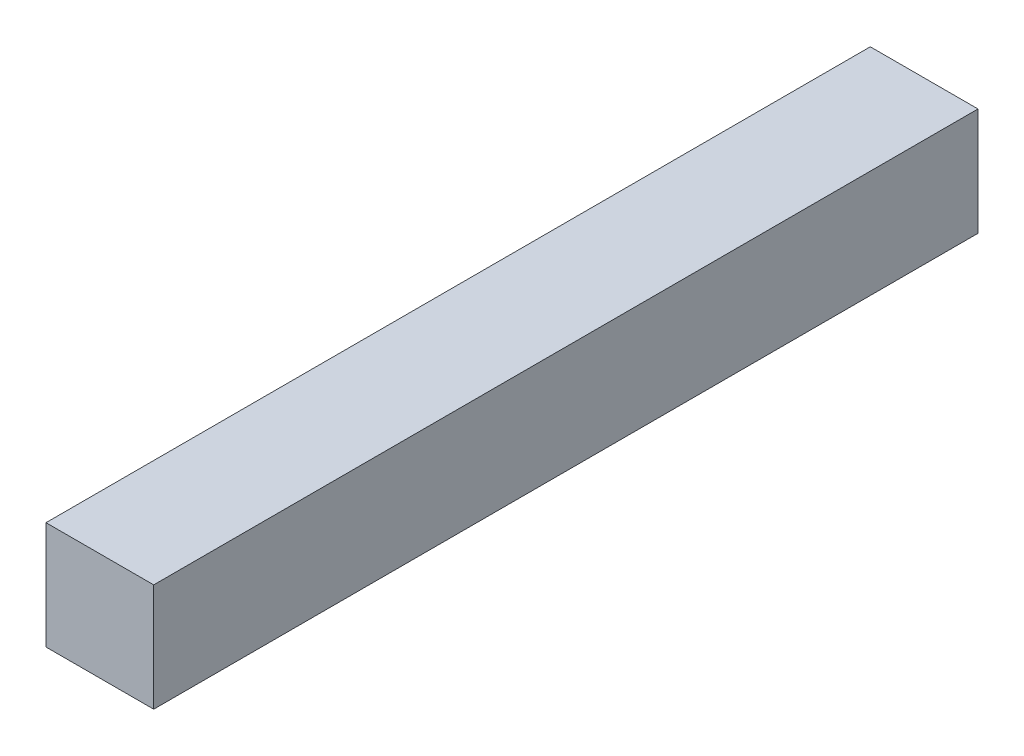
ISO-10303-21;
HEADER;
FILE_DESCRIPTION(('STEP AP214'),'2;1');
FILE_NAME('part.step','',(''),(''),'','','');
FILE_SCHEMA(('AUTOMOTIVE_DESIGN { 1 0 10303 214 1 1 1 1 }'));
ENDSEC;
DATA;
#1=APPLICATION_CONTEXT('core data for automotive mechanical design processes');
#2=APPLICATION_PROTOCOL_DEFINITION('international standard','automotive_design',2000,#1);
#3=PRODUCT_CONTEXT('',#1,'mechanical');
#4=PRODUCT('Part','Part','',(#3));
#5=PRODUCT_RELATED_PRODUCT_CATEGORY('part','',(#4));
#6=PRODUCT_DEFINITION_FORMATION('','',#4);
#7=PRODUCT_DEFINITION_CONTEXT('part definition',#1,'design');
#8=PRODUCT_DEFINITION('design','',#6,#7);
#9=PRODUCT_DEFINITION_SHAPE('','',#8);
#10=(LENGTH_UNIT() NAMED_UNIT(*) SI_UNIT(.MILLI.,.METRE.));
#11=(NAMED_UNIT(*) PLANE_ANGLE_UNIT() SI_UNIT($,.RADIAN.));
#12=(NAMED_UNIT(*) SI_UNIT($,.STERADIAN.) SOLID_ANGLE_UNIT());
#13=UNCERTAINTY_MEASURE_WITH_UNIT(LENGTH_MEASURE(1.E-05),#10,'distance_accuracy_value','');
#14=(GEOMETRIC_REPRESENTATION_CONTEXT(3) GLOBAL_UNCERTAINTY_ASSIGNED_CONTEXT((#13)) GLOBAL_UNIT_ASSIGNED_CONTEXT((#10,
#11,#12)) REPRESENTATION_CONTEXT('',''));
#15=CARTESIAN_POINT('',(0.,0.,0.));
#16=DIRECTION('',(0.,0.,1.));
#17=DIRECTION('',(1.,0.,0.));
#18=AXIS2_PLACEMENT_3D('',#15,#16,#17);
#19=CARTESIAN_POINT('',(-40.,40.,0.));
#20=DIRECTION('',(0.,0.,1.));
#21=DIRECTION('',(1.,0.,0.));
#22=AXIS2_PLACEMENT_3D('',#19,#20,#21);
#23=PLANE('',#22);
#24=DIRECTION('',(-1.,0.,0.));
#25=VECTOR('',#24,1.);
#26=CARTESIAN_POINT('',(-40.,0.,0.));
#27=LINE('',#26,#25);
#28=CARTESIAN_POINT('',(0.,0.,0.));
#29=VERTEX_POINT('',#28);
#30=CARTESIAN_POINT('',(-40.,0.,0.));
#31=VERTEX_POINT('',#30);
#32=EDGE_CURVE('E98',#29,#31,#27,.T.);
#33=ORIENTED_EDGE('',*,*,#32,.T.);
#34=DIRECTION('',(0.,-1.,0.));
#35=VECTOR('',#34,1.);
#36=CARTESIAN_POINT('',(-40.,40.,0.));
#37=LINE('',#36,#35);
#38=CARTESIAN_POINT('',(-40.,40.,0.));
#39=VERTEX_POINT('',#38);
#40=EDGE_CURVE('E11',#39,#31,#37,.T.);
#41=ORIENTED_EDGE('',*,*,#40,.F.);
#42=DIRECTION('',(-1.,0.,0.));
#43=VECTOR('',#42,1.);
#44=CARTESIAN_POINT('',(-40.,40.,0.));
#45=LINE('',#44,#43);
#46=CARTESIAN_POINT('',(0.,40.,0.));
#47=VERTEX_POINT('',#46);
#48=EDGE_CURVE('E86',#47,#39,#45,.T.);
#49=ORIENTED_EDGE('',*,*,#48,.F.);
#50=DIRECTION('',(0.,-1.,0.));
#51=VECTOR('',#50,1.);
#52=CARTESIAN_POINT('',(0.,40.,0.));
#53=LINE('',#52,#51);
#54=EDGE_CURVE('E94',#47,#29,#53,.T.);
#55=ORIENTED_EDGE('',*,*,#54,.T.);
#56=EDGE_LOOP('',(#33,#41,#49,#55));
#57=FACE_BOUND('',#56,.T.);
#58=ADVANCED_FACE('F35',(#57),#23,.F.);
#59=CARTESIAN_POINT('',(-40.,40.,306.13169485879));
#60=DIRECTION('',(1.,0.,0.));
#61=DIRECTION('',(0.,0.,-1.));
#62=AXIS2_PLACEMENT_3D('',#59,#60,#61);
#63=PLANE('',#62);
#64=DIRECTION('',(0.,0.,1.));
#65=VECTOR('',#64,1.);
#66=CARTESIAN_POINT('',(-40.,0.,306.13169485879));
#67=LINE('',#66,#65);
#68=CARTESIAN_POINT('',(-40.,0.,306.13169485879));
#69=VERTEX_POINT('',#68);
#70=EDGE_CURVE('E90',#31,#69,#67,.T.);
#71=ORIENTED_EDGE('',*,*,#70,.T.);
#72=DIRECTION('',(0.,-1.,0.));
#73=VECTOR('',#72,1.);
#74=CARTESIAN_POINT('',(-40.,40.,306.13169485879));
#75=LINE('',#74,#73);
#76=CARTESIAN_POINT('',(-40.,40.,306.13169485879));
#77=VERTEX_POINT('',#76);
#78=EDGE_CURVE('E43',#77,#69,#75,.T.);
#79=ORIENTED_EDGE('',*,*,#78,.F.);
#80=DIRECTION('',(0.,0.,1.));
#81=VECTOR('',#80,1.);
#82=CARTESIAN_POINT('',(-40.,40.,306.13169485879));
#83=LINE('',#82,#81);
#84=EDGE_CURVE('E81',#39,#77,#83,.T.);
#85=ORIENTED_EDGE('',*,*,#84,.F.);
#86=ORIENTED_EDGE('',*,*,#40,.T.);
#87=EDGE_LOOP('',(#71,#79,#85,#86));
#88=FACE_BOUND('',#87,.T.);
#89=ADVANCED_FACE('F89',(#88),#63,.F.);
#90=CARTESIAN_POINT('',(0.,40.,306.13169485879));
#91=DIRECTION('',(0.,0.,-1.));
#92=DIRECTION('',(-1.,0.,0.));
#93=AXIS2_PLACEMENT_3D('',#90,#91,#92);
#94=PLANE('',#93);
#95=DIRECTION('',(1.,0.,0.));
#96=VECTOR('',#95,1.);
#97=CARTESIAN_POINT('',(0.,0.,306.13169485879));
#98=LINE('',#97,#96);
#99=CARTESIAN_POINT('',(0.,0.,306.13169485879));
#100=VERTEX_POINT('',#99);
#101=EDGE_CURVE('E68',#69,#100,#98,.T.);
#102=ORIENTED_EDGE('',*,*,#101,.T.);
#103=DIRECTION('',(0.,-1.,0.));
#104=VECTOR('',#103,1.);
#105=CARTESIAN_POINT('',(0.,40.,306.13169485879));
#106=LINE('',#105,#104);
#107=CARTESIAN_POINT('',(0.,40.,306.13169485879));
#108=VERTEX_POINT('',#107);
#109=EDGE_CURVE('E91',#108,#100,#106,.T.);
#110=ORIENTED_EDGE('',*,*,#109,.F.);
#111=DIRECTION('',(1.,0.,0.));
#112=VECTOR('',#111,1.);
#113=CARTESIAN_POINT('',(0.,40.,306.13169485879));
#114=LINE('',#113,#112);
#115=EDGE_CURVE('E84',#77,#108,#114,.T.);
#116=ORIENTED_EDGE('',*,*,#115,.F.);
#117=ORIENTED_EDGE('',*,*,#78,.T.);
#118=EDGE_LOOP('',(#102,#110,#116,#117));
#119=FACE_BOUND('',#118,.T.);
#120=ADVANCED_FACE('F92',(#119),#94,.F.);
#121=CARTESIAN_POINT('',(0.,40.,0.));
#122=DIRECTION('',(-1.,0.,0.));
#123=DIRECTION('',(0.,0.,1.));
#124=AXIS2_PLACEMENT_3D('',#121,#122,#123);
#125=PLANE('',#124);
#126=DIRECTION('',(0.,0.,-1.));
#127=VECTOR('',#126,1.);
#128=CARTESIAN_POINT('',(0.,0.,0.));
#129=LINE('',#128,#127);
#130=EDGE_CURVE('E74',#100,#29,#129,.T.);
#131=ORIENTED_EDGE('',*,*,#130,.T.);
#132=ORIENTED_EDGE('',*,*,#54,.F.);
#133=DIRECTION('',(0.,0.,-1.));
#134=VECTOR('',#133,1.);
#135=CARTESIAN_POINT('',(0.,40.,0.));
#136=LINE('',#135,#134);
#137=EDGE_CURVE('E51',#108,#47,#136,.T.);
#138=ORIENTED_EDGE('',*,*,#137,.F.);
#139=ORIENTED_EDGE('',*,*,#109,.T.);
#140=EDGE_LOOP('',(#131,#132,#138,#139));
#141=FACE_BOUND('',#140,.T.);
#142=ADVANCED_FACE('F105',(#141),#125,.F.);
#143=CARTESIAN_POINT('',(0.,40.,0.));
#144=DIRECTION('',(0.,-1.,0.));
#145=DIRECTION('',(0.,0.,-1.));
#146=AXIS2_PLACEMENT_3D('',#143,#144,#145);
#147=PLANE('',#146);
#148=ORIENTED_EDGE('',*,*,#48,.T.);
#149=ORIENTED_EDGE('',*,*,#84,.T.);
#150=ORIENTED_EDGE('',*,*,#115,.T.);
#151=ORIENTED_EDGE('',*,*,#137,.T.);
#152=EDGE_LOOP('',(#148,#149,#150,#151));
#153=FACE_BOUND('',#152,.T.);
#154=ADVANCED_FACE('F82',(#153),#147,.F.);
#155=CARTESIAN_POINT('',(0.,0.,0.));
#156=DIRECTION('',(0.,-1.,0.));
#157=DIRECTION('',(0.,0.,-1.));
#158=AXIS2_PLACEMENT_3D('',#155,#156,#157);
#159=PLANE('',#158);
#160=ORIENTED_EDGE('',*,*,#32,.F.);
#161=ORIENTED_EDGE('',*,*,#130,.F.);
#162=ORIENTED_EDGE('',*,*,#101,.F.);
#163=ORIENTED_EDGE('',*,*,#70,.F.);
#164=EDGE_LOOP('',(#160,#161,#162,#163));
#165=FACE_BOUND('',#164,.T.);
#166=ADVANCED_FACE('F108',(#165),#159,.T.);
#167=CLOSED_SHELL('',(#58,#89,#120,#142,#154,#166));
#168=MANIFOLD_SOLID_BREP('B2',#167);
#169=ADVANCED_BREP_SHAPE_REPRESENTATION('',(#18,#168),#14);
#170=SHAPE_DEFINITION_REPRESENTATION(#9,#169);
ENDSEC;
END-ISO-10303-21;
